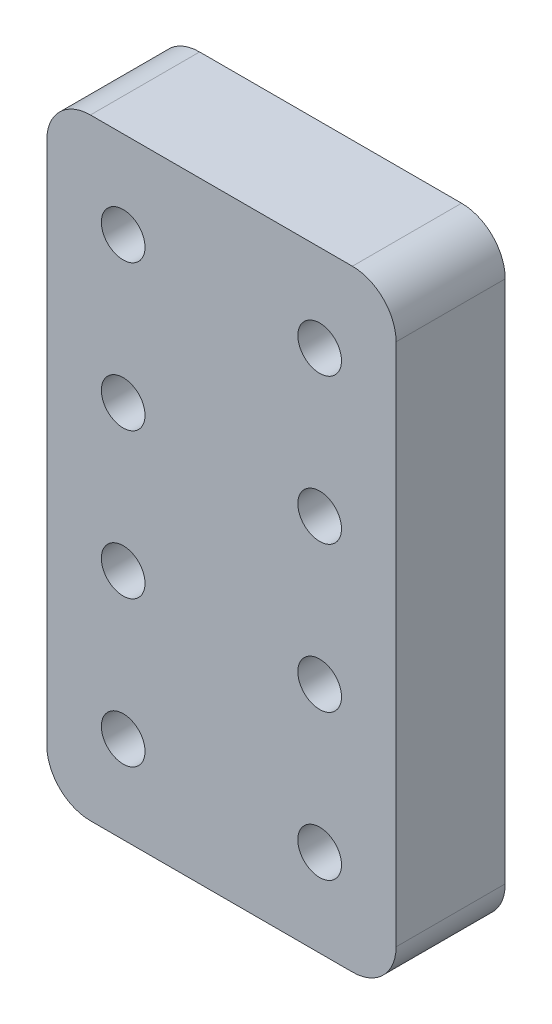
ISO-10303-21;
HEADER;
FILE_DESCRIPTION(('STEP AP214'),'2;1');
FILE_NAME('part.step','',(''),(''),'','','');
FILE_SCHEMA(('AUTOMOTIVE_DESIGN { 1 0 10303 214 1 1 1 1 }'));
ENDSEC;
DATA;
#1=APPLICATION_CONTEXT('core data for automotive mechanical design processes');
#2=APPLICATION_PROTOCOL_DEFINITION('international standard','automotive_design',2000,#1);
#3=PRODUCT_CONTEXT('',#1,'mechanical');
#4=PRODUCT('Part','Part','',(#3));
#5=PRODUCT_RELATED_PRODUCT_CATEGORY('part','',(#4));
#6=PRODUCT_DEFINITION_FORMATION('','',#4);
#7=PRODUCT_DEFINITION_CONTEXT('part definition',#1,'design');
#8=PRODUCT_DEFINITION('design','',#6,#7);
#9=PRODUCT_DEFINITION_SHAPE('','',#8);
#10=(LENGTH_UNIT() NAMED_UNIT(*) SI_UNIT(.MILLI.,.METRE.));
#11=(NAMED_UNIT(*) PLANE_ANGLE_UNIT() SI_UNIT($,.RADIAN.));
#12=(NAMED_UNIT(*) SI_UNIT($,.STERADIAN.) SOLID_ANGLE_UNIT());
#13=UNCERTAINTY_MEASURE_WITH_UNIT(LENGTH_MEASURE(1.E-05),#10,'distance_accuracy_value','');
#14=(GEOMETRIC_REPRESENTATION_CONTEXT(3) GLOBAL_UNCERTAINTY_ASSIGNED_CONTEXT((#13)) GLOBAL_UNIT_ASSIGNED_CONTEXT((#10,
#11,#12)) REPRESENTATION_CONTEXT('',''));
#15=CARTESIAN_POINT('',(0.,0.,0.));
#16=DIRECTION('',(0.,0.,1.));
#17=DIRECTION('',(1.,0.,0.));
#18=AXIS2_PLACEMENT_3D('',#15,#16,#17);
#19=CARTESIAN_POINT('',(-11.9999999999992,-24.0000000000001,10.));
#20=DIRECTION('',(0.,0.,-1.));
#21=DIRECTION('',(-1.,0.,0.));
#22=AXIS2_PLACEMENT_3D('',#19,#20,#21);
#23=PLANE('',#22);
#24=CARTESIAN_POINT('',(-11.9999999999992,-24.0000000000001,10.));
#25=DIRECTION('',(0.,0.,1.));
#26=DIRECTION('',(-1.,0.,0.));
#27=AXIS2_PLACEMENT_3D('',#24,#25,#26);
#28=CIRCLE('',#27,4.);
#29=CARTESIAN_POINT('',(-15.9999999999992,-24.0000000000001,10.));
#30=VERTEX_POINT('',#29);
#31=CARTESIAN_POINT('',(-11.9999999999991,-28.0000000000001,10.));
#32=VERTEX_POINT('',#31);
#33=EDGE_CURVE('E164',#30,#32,#28,.T.);
#34=ORIENTED_EDGE('',*,*,#33,.T.);
#35=DIRECTION('',(1.,0.,0.));
#36=VECTOR('',#35,1.);
#37=CARTESIAN_POINT('',(12.0000000000009,-27.9999999999999,10.));
#38=LINE('',#37,#36);
#39=CARTESIAN_POINT('',(12.0000000000009,-27.9999999999999,10.));
#40=VERTEX_POINT('',#39);
#41=EDGE_CURVE('E100',#32,#40,#38,.T.);
#42=ORIENTED_EDGE('',*,*,#41,.T.);
#43=CARTESIAN_POINT('',(12.0000000000008,-23.9999999999999,10.));
#44=DIRECTION('',(0.,0.,1.));
#45=DIRECTION('',(-1.,0.,0.));
#46=AXIS2_PLACEMENT_3D('',#43,#44,#45);
#47=CIRCLE('',#46,4.);
#48=CARTESIAN_POINT('',(16.0000000000008,-23.9999999999999,10.));
#49=VERTEX_POINT('',#48);
#50=EDGE_CURVE('E185',#40,#49,#47,.T.);
#51=ORIENTED_EDGE('',*,*,#50,.T.);
#52=DIRECTION('',(0.,1.,0.));
#53=VECTOR('',#52,1.);
#54=CARTESIAN_POINT('',(16.0000000000008,24.0000000000001,10.));
#55=LINE('',#54,#53);
#56=CARTESIAN_POINT('',(16.0000000000008,24.0000000000001,10.));
#57=VERTEX_POINT('',#56);
#58=EDGE_CURVE('E199',#49,#57,#55,.T.);
#59=ORIENTED_EDGE('',*,*,#58,.T.);
#60=CARTESIAN_POINT('',(12.0000000000008,24.0000000000001,10.));
#61=DIRECTION('',(0.,0.,1.));
#62=DIRECTION('',(-1.,0.,0.));
#63=AXIS2_PLACEMENT_3D('',#60,#61,#62);
#64=CIRCLE('',#63,4.);
#65=CARTESIAN_POINT('',(12.0000000000008,28.0000000000001,10.));
#66=VERTEX_POINT('',#65);
#67=EDGE_CURVE('E119',#57,#66,#64,.T.);
#68=ORIENTED_EDGE('',*,*,#67,.T.);
#69=DIRECTION('',(-1.,0.,0.));
#70=VECTOR('',#69,1.);
#71=CARTESIAN_POINT('',(12.0000000000008,28.0000000000001,10.));
#72=LINE('',#71,#70);
#73=CARTESIAN_POINT('',(-11.9999999999992,27.9999999999999,10.));
#74=VERTEX_POINT('',#73);
#75=EDGE_CURVE('E113',#66,#74,#72,.T.);
#76=ORIENTED_EDGE('',*,*,#75,.T.);
#77=CARTESIAN_POINT('',(-11.9999999999992,23.9999999999999,10.));
#78=DIRECTION('',(0.,0.,1.));
#79=DIRECTION('',(1.,0.,0.));
#80=AXIS2_PLACEMENT_3D('',#77,#78,#79);
#81=CIRCLE('',#80,4.);
#82=CARTESIAN_POINT('',(-15.9999999999992,23.9999999999999,10.));
#83=VERTEX_POINT('',#82);
#84=EDGE_CURVE('E117',#74,#83,#81,.T.);
#85=ORIENTED_EDGE('',*,*,#84,.T.);
#86=DIRECTION('',(0.,-1.,0.));
#87=VECTOR('',#86,1.);
#88=CARTESIAN_POINT('',(-15.9999999999992,23.9999999999999,10.));
#89=LINE('',#88,#87);
#90=EDGE_CURVE('E57',#83,#30,#89,.T.);
#91=ORIENTED_EDGE('',*,*,#90,.T.);
#92=EDGE_LOOP('',(#34,#42,#51,#59,#68,#76,#85,#91));
#93=FACE_BOUND('',#92,.T.);
#94=CARTESIAN_POINT('',(8.99999999999912,20.0000000000001,10.));
#95=DIRECTION('',(0.,0.,1.));
#96=DIRECTION('',(1.,0.,0.));
#97=AXIS2_PLACEMENT_3D('',#94,#95,#96);
#98=CIRCLE('',#97,2.00000000000079);
#99=CARTESIAN_POINT('',(10.9999999999999,20.0000000000001,10.));
#100=VERTEX_POINT('',#99);
#101=EDGE_CURVE('E146',#100,#100,#98,.T.);
#102=ORIENTED_EDGE('',*,*,#101,.F.);
#103=EDGE_LOOP('',(#102));
#104=FACE_BOUND('',#103,.T.);
#105=CARTESIAN_POINT('',(9.00000000000014,6.66666666666695,10.));
#106=DIRECTION('',(0.,0.,1.));
#107=DIRECTION('',(1.,0.,0.));
#108=AXIS2_PLACEMENT_3D('',#105,#106,#107);
#109=CIRCLE('',#108,2.);
#110=CARTESIAN_POINT('',(11.0000000000001,6.66666666666695,10.));
#111=VERTEX_POINT('',#110);
#112=EDGE_CURVE('E213',#111,#111,#109,.T.);
#113=ORIENTED_EDGE('',*,*,#112,.F.);
#114=EDGE_LOOP('',(#113));
#115=FACE_BOUND('',#114,.T.);
#116=CARTESIAN_POINT('',(9.00000000000028,-6.66666666666638,10.));
#117=DIRECTION('',(0.,0.,1.));
#118=DIRECTION('',(1.,0.,0.));
#119=AXIS2_PLACEMENT_3D('',#116,#117,#118);
#120=CIRCLE('',#119,2.);
#121=CARTESIAN_POINT('',(11.0000000000003,-6.66666666666638,10.));
#122=VERTEX_POINT('',#121);
#123=EDGE_CURVE('E221',#122,#122,#120,.T.);
#124=ORIENTED_EDGE('',*,*,#123,.F.);
#125=EDGE_LOOP('',(#124));
#126=FACE_BOUND('',#125,.T.);
#127=CARTESIAN_POINT('',(8.99999999999911,-19.9999999999999,10.));
#128=DIRECTION('',(0.,0.,1.));
#129=DIRECTION('',(1.,0.,0.));
#130=AXIS2_PLACEMENT_3D('',#127,#128,#129);
#131=CIRCLE('',#130,2.00000000000025);
#132=CARTESIAN_POINT('',(10.9999999999994,-19.9999999999999,10.));
#133=VERTEX_POINT('',#132);
#134=EDGE_CURVE('E229',#133,#133,#131,.T.);
#135=ORIENTED_EDGE('',*,*,#134,.F.);
#136=EDGE_LOOP('',(#135));
#137=FACE_BOUND('',#136,.T.);
#138=CARTESIAN_POINT('',(-8.99999999999937,-19.9999999999999,10.));
#139=DIRECTION('',(0.,0.,1.));
#140=DIRECTION('',(-1.,0.,0.));
#141=AXIS2_PLACEMENT_3D('',#138,#139,#140);
#142=CIRCLE('',#141,2.);
#143=CARTESIAN_POINT('',(-10.9999999999994,-19.9999999999999,10.));
#144=VERTEX_POINT('',#143);
#145=EDGE_CURVE('E237',#144,#144,#142,.T.);
#146=ORIENTED_EDGE('',*,*,#145,.F.);
#147=EDGE_LOOP('',(#146));
#148=FACE_BOUND('',#147,.T.);
#149=CARTESIAN_POINT('',(-9.00000000000028,-6.66666666666638,10.));
#150=DIRECTION('',(0.,0.,1.));
#151=DIRECTION('',(-1.,0.,0.));
#152=AXIS2_PLACEMENT_3D('',#149,#150,#151);
#153=CIRCLE('',#152,2.);
#154=CARTESIAN_POINT('',(-11.0000000000003,-6.66666666666638,10.));
#155=VERTEX_POINT('',#154);
#156=EDGE_CURVE('E245',#155,#155,#153,.T.);
#157=ORIENTED_EDGE('',*,*,#156,.F.);
#158=EDGE_LOOP('',(#157));
#159=FACE_BOUND('',#158,.T.);
#160=CARTESIAN_POINT('',(-9.00000000000014,6.66666666666695,10.));
#161=DIRECTION('',(0.,0.,1.));
#162=DIRECTION('',(-1.,0.,0.));
#163=AXIS2_PLACEMENT_3D('',#160,#161,#162);
#164=CIRCLE('',#163,2.);
#165=CARTESIAN_POINT('',(-11.0000000000001,6.66666666666695,10.));
#166=VERTEX_POINT('',#165);
#167=EDGE_CURVE('E253',#166,#166,#164,.T.);
#168=ORIENTED_EDGE('',*,*,#167,.F.);
#169=EDGE_LOOP('',(#168));
#170=FACE_BOUND('',#169,.T.);
#171=CARTESIAN_POINT('',(-9.,20.0000000000003,10.));
#172=DIRECTION('',(0.,0.,1.));
#173=DIRECTION('',(-1.,0.,0.));
#174=AXIS2_PLACEMENT_3D('',#171,#172,#173);
#175=CIRCLE('',#174,1.99999999999996);
#176=CARTESIAN_POINT('',(-11.,20.0000000000003,10.));
#177=VERTEX_POINT('',#176);
#178=EDGE_CURVE('E261',#177,#177,#175,.T.);
#179=ORIENTED_EDGE('',*,*,#178,.F.);
#180=EDGE_LOOP('',(#179));
#181=FACE_BOUND('',#180,.T.);
#182=ADVANCED_FACE('F39',(#93,#104,#115,#126,#137,#148,#159,#170,#181),#23,.F.);
#183=CARTESIAN_POINT('',(-11.9999999999992,-24.0000000000001,0.));
#184=DIRECTION('',(0.,0.,-1.));
#185=DIRECTION('',(-1.,0.,0.));
#186=AXIS2_PLACEMENT_3D('',#183,#184,#185);
#187=PLANE('',#186);
#188=CARTESIAN_POINT('',(-9.00000000000014,6.66666666666695,0.));
#189=DIRECTION('',(0.,0.,1.));
#190=DIRECTION('',(-1.,0.,0.));
#191=AXIS2_PLACEMENT_3D('',#188,#189,#190);
#192=CIRCLE('',#191,2.);
#193=CARTESIAN_POINT('',(-11.0000000000001,6.66666666666695,0.));
#194=VERTEX_POINT('',#193);
#195=EDGE_CURVE('E257',#194,#194,#192,.T.);
#196=ORIENTED_EDGE('',*,*,#195,.T.);
#197=EDGE_LOOP('',(#196));
#198=FACE_BOUND('',#197,.T.);
#199=CARTESIAN_POINT('',(-8.99999999999937,-19.9999999999999,0.));
#200=DIRECTION('',(0.,0.,1.));
#201=DIRECTION('',(-1.,0.,0.));
#202=AXIS2_PLACEMENT_3D('',#199,#200,#201);
#203=CIRCLE('',#202,2.);
#204=CARTESIAN_POINT('',(-10.9999999999994,-19.9999999999999,0.));
#205=VERTEX_POINT('',#204);
#206=EDGE_CURVE('E241',#205,#205,#203,.T.);
#207=ORIENTED_EDGE('',*,*,#206,.T.);
#208=EDGE_LOOP('',(#207));
#209=FACE_BOUND('',#208,.T.);
#210=CARTESIAN_POINT('',(9.00000000000028,-6.66666666666638,0.));
#211=DIRECTION('',(0.,0.,1.));
#212=DIRECTION('',(1.,0.,0.));
#213=AXIS2_PLACEMENT_3D('',#210,#211,#212);
#214=CIRCLE('',#213,2.);
#215=CARTESIAN_POINT('',(11.0000000000003,-6.66666666666638,0.));
#216=VERTEX_POINT('',#215);
#217=EDGE_CURVE('E225',#216,#216,#214,.T.);
#218=ORIENTED_EDGE('',*,*,#217,.T.);
#219=EDGE_LOOP('',(#218));
#220=FACE_BOUND('',#219,.T.);
#221=CARTESIAN_POINT('',(8.99999999999912,20.0000000000001,0.));
#222=DIRECTION('',(0.,0.,1.));
#223=DIRECTION('',(1.,0.,0.));
#224=AXIS2_PLACEMENT_3D('',#221,#222,#223);
#225=CIRCLE('',#224,2.00000000000079);
#226=CARTESIAN_POINT('',(10.9999999999999,20.0000000000001,0.));
#227=VERTEX_POINT('',#226);
#228=EDGE_CURVE('E209',#227,#227,#225,.T.);
#229=ORIENTED_EDGE('',*,*,#228,.T.);
#230=EDGE_LOOP('',(#229));
#231=FACE_BOUND('',#230,.T.);
#232=CARTESIAN_POINT('',(-11.9999999999992,-24.0000000000001,0.));
#233=DIRECTION('',(0.,0.,1.));
#234=DIRECTION('',(-1.,0.,0.));
#235=AXIS2_PLACEMENT_3D('',#232,#233,#234);
#236=CIRCLE('',#235,4.);
#237=CARTESIAN_POINT('',(-15.9999999999992,-24.0000000000001,0.));
#238=VERTEX_POINT('',#237);
#239=CARTESIAN_POINT('',(-11.9999999999991,-28.0000000000001,0.));
#240=VERTEX_POINT('',#239);
#241=EDGE_CURVE('E141',#238,#240,#236,.T.);
#242=ORIENTED_EDGE('',*,*,#241,.F.);
#243=DIRECTION('',(0.,-1.,0.));
#244=VECTOR('',#243,1.);
#245=CARTESIAN_POINT('',(-15.9999999999992,23.9999999999999,0.));
#246=LINE('',#245,#244);
#247=CARTESIAN_POINT('',(-15.9999999999992,23.9999999999999,0.));
#248=VERTEX_POINT('',#247);
#249=EDGE_CURVE('E92',#248,#238,#246,.T.);
#250=ORIENTED_EDGE('',*,*,#249,.F.);
#251=CARTESIAN_POINT('',(-11.9999999999992,23.9999999999999,0.));
#252=DIRECTION('',(0.,0.,1.));
#253=DIRECTION('',(1.,0.,0.));
#254=AXIS2_PLACEMENT_3D('',#251,#252,#253);
#255=CIRCLE('',#254,4.);
#256=CARTESIAN_POINT('',(-11.9999999999992,27.9999999999999,0.));
#257=VERTEX_POINT('',#256);
#258=EDGE_CURVE('E86',#257,#248,#255,.T.);
#259=ORIENTED_EDGE('',*,*,#258,.F.);
#260=DIRECTION('',(-1.,0.,0.));
#261=VECTOR('',#260,1.);
#262=CARTESIAN_POINT('',(12.0000000000008,28.0000000000001,0.));
#263=LINE('',#262,#261);
#264=CARTESIAN_POINT('',(12.0000000000008,28.0000000000001,0.));
#265=VERTEX_POINT('',#264);
#266=EDGE_CURVE('E128',#265,#257,#263,.T.);
#267=ORIENTED_EDGE('',*,*,#266,.F.);
#268=CARTESIAN_POINT('',(12.0000000000008,24.0000000000001,0.));
#269=DIRECTION('',(0.,0.,1.));
#270=DIRECTION('',(-1.,0.,0.));
#271=AXIS2_PLACEMENT_3D('',#268,#269,#270);
#272=CIRCLE('',#271,4.);
#273=CARTESIAN_POINT('',(16.0000000000008,24.0000000000001,0.));
#274=VERTEX_POINT('',#273);
#275=EDGE_CURVE('E155',#274,#265,#272,.T.);
#276=ORIENTED_EDGE('',*,*,#275,.F.);
#277=DIRECTION('',(0.,1.,0.));
#278=VECTOR('',#277,1.);
#279=CARTESIAN_POINT('',(16.0000000000008,24.0000000000001,0.));
#280=LINE('',#279,#278);
#281=CARTESIAN_POINT('',(16.0000000000008,-23.9999999999999,0.));
#282=VERTEX_POINT('',#281);
#283=EDGE_CURVE('E152',#282,#274,#280,.T.);
#284=ORIENTED_EDGE('',*,*,#283,.F.);
#285=CARTESIAN_POINT('',(12.0000000000008,-23.9999999999999,0.));
#286=DIRECTION('',(0.,0.,1.));
#287=DIRECTION('',(-1.,0.,0.));
#288=AXIS2_PLACEMENT_3D('',#285,#286,#287);
#289=CIRCLE('',#288,4.);
#290=CARTESIAN_POINT('',(12.0000000000009,-27.9999999999999,0.));
#291=VERTEX_POINT('',#290);
#292=EDGE_CURVE('E149',#291,#282,#289,.T.);
#293=ORIENTED_EDGE('',*,*,#292,.F.);
#294=DIRECTION('',(1.,0.,0.));
#295=VECTOR('',#294,1.);
#296=CARTESIAN_POINT('',(12.0000000000009,-27.9999999999999,0.));
#297=LINE('',#296,#295);
#298=EDGE_CURVE('E145',#240,#291,#297,.T.);
#299=ORIENTED_EDGE('',*,*,#298,.F.);
#300=EDGE_LOOP('',(#242,#250,#259,#267,#276,#284,#293,#299));
#301=FACE_BOUND('',#300,.T.);
#302=CARTESIAN_POINT('',(9.00000000000014,6.66666666666695,0.));
#303=DIRECTION('',(0.,0.,1.));
#304=DIRECTION('',(1.,0.,0.));
#305=AXIS2_PLACEMENT_3D('',#302,#303,#304);
#306=CIRCLE('',#305,2.);
#307=CARTESIAN_POINT('',(11.0000000000001,6.66666666666695,0.));
#308=VERTEX_POINT('',#307);
#309=EDGE_CURVE('E217',#308,#308,#306,.T.);
#310=ORIENTED_EDGE('',*,*,#309,.T.);
#311=EDGE_LOOP('',(#310));
#312=FACE_BOUND('',#311,.T.);
#313=CARTESIAN_POINT('',(8.99999999999911,-19.9999999999999,0.));
#314=DIRECTION('',(0.,0.,1.));
#315=DIRECTION('',(1.,0.,0.));
#316=AXIS2_PLACEMENT_3D('',#313,#314,#315);
#317=CIRCLE('',#316,2.00000000000025);
#318=CARTESIAN_POINT('',(10.9999999999994,-19.9999999999999,0.));
#319=VERTEX_POINT('',#318);
#320=EDGE_CURVE('E233',#319,#319,#317,.T.);
#321=ORIENTED_EDGE('',*,*,#320,.T.);
#322=EDGE_LOOP('',(#321));
#323=FACE_BOUND('',#322,.T.);
#324=CARTESIAN_POINT('',(-9.00000000000028,-6.66666666666638,0.));
#325=DIRECTION('',(0.,0.,1.));
#326=DIRECTION('',(-1.,0.,0.));
#327=AXIS2_PLACEMENT_3D('',#324,#325,#326);
#328=CIRCLE('',#327,2.);
#329=CARTESIAN_POINT('',(-11.0000000000003,-6.66666666666638,0.));
#330=VERTEX_POINT('',#329);
#331=EDGE_CURVE('E249',#330,#330,#328,.T.);
#332=ORIENTED_EDGE('',*,*,#331,.T.);
#333=EDGE_LOOP('',(#332));
#334=FACE_BOUND('',#333,.T.);
#335=CARTESIAN_POINT('',(-9.,20.0000000000003,0.));
#336=DIRECTION('',(0.,0.,1.));
#337=DIRECTION('',(-1.,0.,0.));
#338=AXIS2_PLACEMENT_3D('',#335,#336,#337);
#339=CIRCLE('',#338,1.99999999999996);
#340=CARTESIAN_POINT('',(-11.,20.0000000000003,0.));
#341=VERTEX_POINT('',#340);
#342=EDGE_CURVE('E265',#341,#341,#339,.T.);
#343=ORIENTED_EDGE('',*,*,#342,.T.);
#344=EDGE_LOOP('',(#343));
#345=FACE_BOUND('',#344,.T.);
#346=ADVANCED_FACE('F189',(#198,#209,#220,#231,#301,#312,#323,#334,#345),#187,.T.);
#347=CARTESIAN_POINT('',(-11.9999999999992,-24.0000000000001,10.));
#348=DIRECTION('',(0.,0.,-1.));
#349=DIRECTION('',(-1.,0.,0.));
#350=AXIS2_PLACEMENT_3D('',#347,#348,#349);
#351=CYLINDRICAL_SURFACE('',#350,4.);
#352=ORIENTED_EDGE('',*,*,#241,.T.);
#353=DIRECTION('',(0.,0.,-1.));
#354=VECTOR('',#353,1.);
#355=CARTESIAN_POINT('',(-11.9999999999991,-28.0000000000001,10.));
#356=LINE('',#355,#354);
#357=EDGE_CURVE('E11',#32,#240,#356,.T.);
#358=ORIENTED_EDGE('',*,*,#357,.F.);
#359=ORIENTED_EDGE('',*,*,#33,.F.);
#360=DIRECTION('',(0.,0.,-1.));
#361=VECTOR('',#360,1.);
#362=CARTESIAN_POINT('',(-15.9999999999992,-24.0000000000001,10.));
#363=LINE('',#362,#361);
#364=EDGE_CURVE('E137',#30,#238,#363,.T.);
#365=ORIENTED_EDGE('',*,*,#364,.T.);
#366=EDGE_LOOP('',(#352,#358,#359,#365));
#367=FACE_BOUND('',#366,.T.);
#368=ADVANCED_FACE('F41',(#367),#351,.T.);
#369=CARTESIAN_POINT('',(12.0000000000009,-27.9999999999999,10.));
#370=DIRECTION('',(0.,1.,0.));
#371=DIRECTION('',(-1.,0.,0.));
#372=AXIS2_PLACEMENT_3D('',#369,#370,#371);
#373=PLANE('',#372);
#374=ORIENTED_EDGE('',*,*,#298,.T.);
#375=DIRECTION('',(0.,0.,-1.));
#376=VECTOR('',#375,1.);
#377=CARTESIAN_POINT('',(12.0000000000009,-27.9999999999999,10.));
#378=LINE('',#377,#376);
#379=EDGE_CURVE('E49',#40,#291,#378,.T.);
#380=ORIENTED_EDGE('',*,*,#379,.F.);
#381=ORIENTED_EDGE('',*,*,#41,.F.);
#382=ORIENTED_EDGE('',*,*,#357,.T.);
#383=EDGE_LOOP('',(#374,#380,#381,#382));
#384=FACE_BOUND('',#383,.T.);
#385=ADVANCED_FACE('F299',(#384),#373,.F.);
#386=CARTESIAN_POINT('',(12.0000000000008,-23.9999999999999,10.));
#387=DIRECTION('',(0.,0.,-1.));
#388=DIRECTION('',(-1.,0.,0.));
#389=AXIS2_PLACEMENT_3D('',#386,#387,#388);
#390=CYLINDRICAL_SURFACE('',#389,4.);
#391=ORIENTED_EDGE('',*,*,#292,.T.);
#392=DIRECTION('',(0.,0.,-1.));
#393=VECTOR('',#392,1.);
#394=CARTESIAN_POINT('',(16.0000000000008,-23.9999999999999,10.));
#395=LINE('',#394,#393);
#396=EDGE_CURVE('E175',#49,#282,#395,.T.);
#397=ORIENTED_EDGE('',*,*,#396,.F.);
#398=ORIENTED_EDGE('',*,*,#50,.F.);
#399=ORIENTED_EDGE('',*,*,#379,.T.);
#400=EDGE_LOOP('',(#391,#397,#398,#399));
#401=FACE_BOUND('',#400,.T.);
#402=ADVANCED_FACE('F183',(#401),#390,.T.);
#403=CARTESIAN_POINT('',(16.0000000000008,24.0000000000001,10.));
#404=DIRECTION('',(-1.,0.,0.));
#405=DIRECTION('',(0.,0.,1.));
#406=AXIS2_PLACEMENT_3D('',#403,#404,#405);
#407=PLANE('',#406);
#408=ORIENTED_EDGE('',*,*,#283,.T.);
#409=DIRECTION('',(0.,0.,-1.));
#410=VECTOR('',#409,1.);
#411=CARTESIAN_POINT('',(16.0000000000008,24.0000000000001,10.));
#412=LINE('',#411,#410);
#413=EDGE_CURVE('E171',#57,#274,#412,.T.);
#414=ORIENTED_EDGE('',*,*,#413,.F.);
#415=ORIENTED_EDGE('',*,*,#58,.F.);
#416=ORIENTED_EDGE('',*,*,#396,.T.);
#417=EDGE_LOOP('',(#408,#414,#415,#416));
#418=FACE_BOUND('',#417,.T.);
#419=ADVANCED_FACE('F194',(#418),#407,.F.);
#420=CARTESIAN_POINT('',(12.0000000000008,24.0000000000001,10.));
#421=DIRECTION('',(0.,0.,-1.));
#422=DIRECTION('',(-1.,0.,0.));
#423=AXIS2_PLACEMENT_3D('',#420,#421,#422);
#424=CYLINDRICAL_SURFACE('',#423,4.);
#425=ORIENTED_EDGE('',*,*,#275,.T.);
#426=DIRECTION('',(0.,0.,-1.));
#427=VECTOR('',#426,1.);
#428=CARTESIAN_POINT('',(12.0000000000008,28.0000000000001,10.));
#429=LINE('',#428,#427);
#430=EDGE_CURVE('E130',#66,#265,#429,.T.);
#431=ORIENTED_EDGE('',*,*,#430,.F.);
#432=ORIENTED_EDGE('',*,*,#67,.F.);
#433=ORIENTED_EDGE('',*,*,#413,.T.);
#434=EDGE_LOOP('',(#425,#431,#432,#433));
#435=FACE_BOUND('',#434,.T.);
#436=ADVANCED_FACE('F197',(#435),#424,.T.);
#437=CARTESIAN_POINT('',(12.0000000000008,28.0000000000001,10.));
#438=DIRECTION('',(0.,-1.,0.));
#439=DIRECTION('',(1.,0.,0.));
#440=AXIS2_PLACEMENT_3D('',#437,#438,#439);
#441=PLANE('',#440);
#442=ORIENTED_EDGE('',*,*,#266,.T.);
#443=DIRECTION('',(0.,0.,-1.));
#444=VECTOR('',#443,1.);
#445=CARTESIAN_POINT('',(-11.9999999999992,27.9999999999999,10.));
#446=LINE('',#445,#444);
#447=EDGE_CURVE('E125',#74,#257,#446,.T.);
#448=ORIENTED_EDGE('',*,*,#447,.F.);
#449=ORIENTED_EDGE('',*,*,#75,.F.);
#450=ORIENTED_EDGE('',*,*,#430,.T.);
#451=EDGE_LOOP('',(#442,#448,#449,#450));
#452=FACE_BOUND('',#451,.T.);
#453=ADVANCED_FACE('F126',(#452),#441,.F.);
#454=CARTESIAN_POINT('',(-11.9999999999992,23.9999999999999,10.));
#455=DIRECTION('',(0.,0.,-1.));
#456=DIRECTION('',(-1.,0.,0.));
#457=AXIS2_PLACEMENT_3D('',#454,#455,#456);
#458=CYLINDRICAL_SURFACE('',#457,4.);
#459=ORIENTED_EDGE('',*,*,#258,.T.);
#460=DIRECTION('',(0.,0.,-1.));
#461=VECTOR('',#460,1.);
#462=CARTESIAN_POINT('',(-15.9999999999992,23.9999999999999,10.));
#463=LINE('',#462,#461);
#464=EDGE_CURVE('E131',#83,#248,#463,.T.);
#465=ORIENTED_EDGE('',*,*,#464,.F.);
#466=ORIENTED_EDGE('',*,*,#84,.F.);
#467=ORIENTED_EDGE('',*,*,#447,.T.);
#468=EDGE_LOOP('',(#459,#465,#466,#467));
#469=FACE_BOUND('',#468,.T.);
#470=ADVANCED_FACE('F133',(#469),#458,.T.);
#471=CARTESIAN_POINT('',(-15.9999999999992,23.9999999999999,10.));
#472=DIRECTION('',(1.,0.,0.));
#473=DIRECTION('',(0.,1.,0.));
#474=AXIS2_PLACEMENT_3D('',#471,#472,#473);
#475=PLANE('',#474);
#476=ORIENTED_EDGE('',*,*,#249,.T.);
#477=ORIENTED_EDGE('',*,*,#364,.F.);
#478=ORIENTED_EDGE('',*,*,#90,.F.);
#479=ORIENTED_EDGE('',*,*,#464,.T.);
#480=EDGE_LOOP('',(#476,#477,#478,#479));
#481=FACE_BOUND('',#480,.T.);
#482=ADVANCED_FACE('F287',(#481),#475,.F.);
#483=CARTESIAN_POINT('',(8.99999999999912,20.0000000000001,10.));
#484=DIRECTION('',(0.,0.,-1.));
#485=DIRECTION('',(-1.,0.,0.));
#486=AXIS2_PLACEMENT_3D('',#483,#484,#485);
#487=CYLINDRICAL_SURFACE('',#486,2.00000000000079);
#488=ORIENTED_EDGE('',*,*,#101,.T.);
#489=EDGE_LOOP('',(#488));
#490=FACE_BOUND('',#489,.T.);
#491=ORIENTED_EDGE('',*,*,#228,.F.);
#492=EDGE_LOOP('',(#491));
#493=FACE_BOUND('',#492,.T.);
#494=ADVANCED_FACE('F284',(#490,#493),#487,.F.);
#495=CARTESIAN_POINT('',(9.00000000000014,6.66666666666695,10.));
#496=DIRECTION('',(0.,0.,-1.));
#497=DIRECTION('',(-1.,0.,0.));
#498=AXIS2_PLACEMENT_3D('',#495,#496,#497);
#499=CYLINDRICAL_SURFACE('',#498,2.);
#500=ORIENTED_EDGE('',*,*,#112,.T.);
#501=EDGE_LOOP('',(#500));
#502=FACE_BOUND('',#501,.T.);
#503=ORIENTED_EDGE('',*,*,#309,.F.);
#504=EDGE_LOOP('',(#503));
#505=FACE_BOUND('',#504,.T.);
#506=ADVANCED_FACE('F363',(#502,#505),#499,.F.);
#507=CARTESIAN_POINT('',(9.00000000000028,-6.66666666666638,10.));
#508=DIRECTION('',(0.,0.,-1.));
#509=DIRECTION('',(-1.,0.,0.));
#510=AXIS2_PLACEMENT_3D('',#507,#508,#509);
#511=CYLINDRICAL_SURFACE('',#510,2.);
#512=ORIENTED_EDGE('',*,*,#123,.T.);
#513=EDGE_LOOP('',(#512));
#514=FACE_BOUND('',#513,.T.);
#515=ORIENTED_EDGE('',*,*,#217,.F.);
#516=EDGE_LOOP('',(#515));
#517=FACE_BOUND('',#516,.T.);
#518=ADVANCED_FACE('F371',(#514,#517),#511,.F.);
#519=CARTESIAN_POINT('',(8.99999999999911,-19.9999999999999,10.));
#520=DIRECTION('',(0.,0.,-1.));
#521=DIRECTION('',(-1.,0.,0.));
#522=AXIS2_PLACEMENT_3D('',#519,#520,#521);
#523=CYLINDRICAL_SURFACE('',#522,2.00000000000025);
#524=ORIENTED_EDGE('',*,*,#134,.T.);
#525=EDGE_LOOP('',(#524));
#526=FACE_BOUND('',#525,.T.);
#527=ORIENTED_EDGE('',*,*,#320,.F.);
#528=EDGE_LOOP('',(#527));
#529=FACE_BOUND('',#528,.T.);
#530=ADVANCED_FACE('F379',(#526,#529),#523,.F.);
#531=CARTESIAN_POINT('',(-8.99999999999937,-19.9999999999999,10.));
#532=DIRECTION('',(0.,0.,-1.));
#533=DIRECTION('',(-1.,0.,0.));
#534=AXIS2_PLACEMENT_3D('',#531,#532,#533);
#535=CYLINDRICAL_SURFACE('',#534,2.);
#536=ORIENTED_EDGE('',*,*,#145,.T.);
#537=EDGE_LOOP('',(#536));
#538=FACE_BOUND('',#537,.T.);
#539=ORIENTED_EDGE('',*,*,#206,.F.);
#540=EDGE_LOOP('',(#539));
#541=FACE_BOUND('',#540,.T.);
#542=ADVANCED_FACE('F388',(#538,#541),#535,.F.);
#543=CARTESIAN_POINT('',(-9.00000000000028,-6.66666666666638,10.));
#544=DIRECTION('',(0.,0.,-1.));
#545=DIRECTION('',(-1.,0.,0.));
#546=AXIS2_PLACEMENT_3D('',#543,#544,#545);
#547=CYLINDRICAL_SURFACE('',#546,2.);
#548=ORIENTED_EDGE('',*,*,#156,.T.);
#549=EDGE_LOOP('',(#548));
#550=FACE_BOUND('',#549,.T.);
#551=ORIENTED_EDGE('',*,*,#331,.F.);
#552=EDGE_LOOP('',(#551));
#553=FACE_BOUND('',#552,.T.);
#554=ADVANCED_FACE('F397',(#550,#553),#547,.F.);
#555=CARTESIAN_POINT('',(-9.00000000000014,6.66666666666695,10.));
#556=DIRECTION('',(0.,0.,-1.));
#557=DIRECTION('',(-1.,0.,0.));
#558=AXIS2_PLACEMENT_3D('',#555,#556,#557);
#559=CYLINDRICAL_SURFACE('',#558,2.);
#560=ORIENTED_EDGE('',*,*,#167,.T.);
#561=EDGE_LOOP('',(#560));
#562=FACE_BOUND('',#561,.T.);
#563=ORIENTED_EDGE('',*,*,#195,.F.);
#564=EDGE_LOOP('',(#563));
#565=FACE_BOUND('',#564,.T.);
#566=ADVANCED_FACE('F406',(#562,#565),#559,.F.);
#567=CARTESIAN_POINT('',(-9.,20.0000000000003,10.));
#568=DIRECTION('',(0.,0.,-1.));
#569=DIRECTION('',(-1.,0.,0.));
#570=AXIS2_PLACEMENT_3D('',#567,#568,#569);
#571=CYLINDRICAL_SURFACE('',#570,1.99999999999996);
#572=ORIENTED_EDGE('',*,*,#178,.T.);
#573=EDGE_LOOP('',(#572));
#574=FACE_BOUND('',#573,.T.);
#575=ORIENTED_EDGE('',*,*,#342,.F.);
#576=EDGE_LOOP('',(#575));
#577=FACE_BOUND('',#576,.T.);
#578=ADVANCED_FACE('F273',(#574,#577),#571,.F.);
#579=CLOSED_SHELL('',(#182,#346,#368,#385,#402,#419,#436,#453,#470,#482,#494,#506,#518,#530,
#542,#554,#566,#578));
#580=MANIFOLD_SOLID_BREP('B2',#579);
#581=ADVANCED_BREP_SHAPE_REPRESENTATION('',(#18,#580),#14);
#582=SHAPE_DEFINITION_REPRESENTATION(#9,#581);
ENDSEC;
END-ISO-10303-21;
